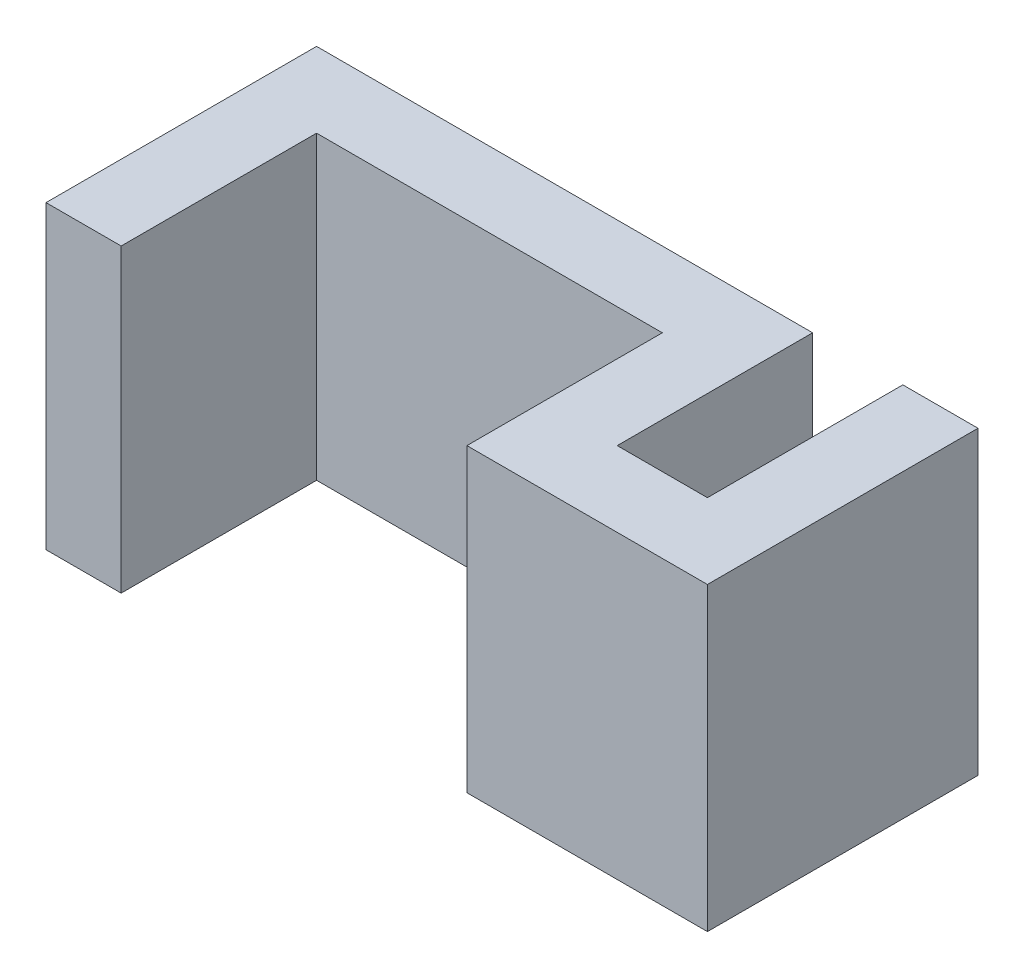
ISO-10303-21;
HEADER;
FILE_DESCRIPTION(('STEP AP214'),'2;1');
FILE_NAME('part.step','',(''),(''),'','','');
FILE_SCHEMA(('AUTOMOTIVE_DESIGN { 1 0 10303 214 1 1 1 1 }'));
ENDSEC;
DATA;
#1=APPLICATION_CONTEXT('core data for automotive mechanical design processes');
#2=APPLICATION_PROTOCOL_DEFINITION('international standard','automotive_design',2000,#1);
#3=PRODUCT_CONTEXT('',#1,'mechanical');
#4=PRODUCT('Part','Part','',(#3));
#5=PRODUCT_RELATED_PRODUCT_CATEGORY('part','',(#4));
#6=PRODUCT_DEFINITION_FORMATION('','',#4);
#7=PRODUCT_DEFINITION_CONTEXT('part definition',#1,'design');
#8=PRODUCT_DEFINITION('design','',#6,#7);
#9=PRODUCT_DEFINITION_SHAPE('','',#8);
#10=(LENGTH_UNIT() NAMED_UNIT(*) SI_UNIT(.MILLI.,.METRE.));
#11=(NAMED_UNIT(*) PLANE_ANGLE_UNIT() SI_UNIT($,.RADIAN.));
#12=(NAMED_UNIT(*) SI_UNIT($,.STERADIAN.) SOLID_ANGLE_UNIT());
#13=UNCERTAINTY_MEASURE_WITH_UNIT(LENGTH_MEASURE(1.E-05),#10,'distance_accuracy_value','');
#14=(GEOMETRIC_REPRESENTATION_CONTEXT(3) GLOBAL_UNCERTAINTY_ASSIGNED_CONTEXT((#13)) GLOBAL_UNIT_ASSIGNED_CONTEXT((#10,
#11,#12)) REPRESENTATION_CONTEXT('',''));
#15=CARTESIAN_POINT('',(0.,0.,0.));
#16=DIRECTION('',(0.,0.,1.));
#17=DIRECTION('',(1.,0.,0.));
#18=AXIS2_PLACEMENT_3D('',#15,#16,#17);
#19=CARTESIAN_POINT('',(71.12,50.8,-45.72));
#20=DIRECTION('',(0.,0.,1.));
#21=DIRECTION('',(1.,0.,0.));
#22=AXIS2_PLACEMENT_3D('',#19,#20,#21);
#23=PLANE('',#22);
#24=DIRECTION('',(-1.,0.,0.));
#25=VECTOR('',#24,1.);
#26=CARTESIAN_POINT('',(71.12,0.,-45.72));
#27=LINE('',#26,#25);
#28=CARTESIAN_POINT('',(71.12,0.,-45.72));
#29=VERTEX_POINT('',#28);
#30=CARTESIAN_POINT('',(-12.7,0.,-45.72));
#31=VERTEX_POINT('',#30);
#32=EDGE_CURVE('E153',#29,#31,#27,.T.);
#33=ORIENTED_EDGE('',*,*,#32,.T.);
#34=DIRECTION('',(0.,-1.,0.));
#35=VECTOR('',#34,1.);
#36=CARTESIAN_POINT('',(-12.7,50.8,-45.72));
#37=LINE('',#36,#35);
#38=CARTESIAN_POINT('',(-12.7,50.8,-45.72));
#39=VERTEX_POINT('',#38);
#40=EDGE_CURVE('E11',#39,#31,#37,.T.);
#41=ORIENTED_EDGE('',*,*,#40,.F.);
#42=DIRECTION('',(-1.,0.,0.));
#43=VECTOR('',#42,1.);
#44=CARTESIAN_POINT('',(71.12,50.8,-45.72));
#45=LINE('',#44,#43);
#46=CARTESIAN_POINT('',(71.12,50.8,-45.72));
#47=VERTEX_POINT('',#46);
#48=EDGE_CURVE('E175',#47,#39,#45,.T.);
#49=ORIENTED_EDGE('',*,*,#48,.F.);
#50=DIRECTION('',(0.,-1.,0.));
#51=VECTOR('',#50,1.);
#52=CARTESIAN_POINT('',(71.12,50.8,-45.72));
#53=LINE('',#52,#51);
#54=EDGE_CURVE('E149',#47,#29,#53,.T.);
#55=ORIENTED_EDGE('',*,*,#54,.T.);
#56=EDGE_LOOP('',(#33,#41,#49,#55));
#57=FACE_BOUND('',#56,.T.);
#58=ADVANCED_FACE('F33',(#57),#23,.F.);
#59=CARTESIAN_POINT('',(-12.7,50.8,-45.72));
#60=DIRECTION('',(1.,0.,0.));
#61=DIRECTION('',(0.,0.,-1.));
#62=AXIS2_PLACEMENT_3D('',#59,#60,#61);
#63=PLANE('',#62);
#64=DIRECTION('',(0.,0.,1.));
#65=VECTOR('',#64,1.);
#66=CARTESIAN_POINT('',(-12.7,0.,-45.72));
#67=LINE('',#66,#65);
#68=CARTESIAN_POINT('',(-12.7,0.,0.));
#69=VERTEX_POINT('',#68);
#70=EDGE_CURVE('E156',#31,#69,#67,.T.);
#71=ORIENTED_EDGE('',*,*,#70,.T.);
#72=DIRECTION('',(0.,-1.,0.));
#73=VECTOR('',#72,1.);
#74=CARTESIAN_POINT('',(-12.7,50.8,0.));
#75=LINE('',#74,#73);
#76=CARTESIAN_POINT('',(-12.7,50.8,0.));
#77=VERTEX_POINT('',#76);
#78=EDGE_CURVE('E41',#77,#69,#75,.T.);
#79=ORIENTED_EDGE('',*,*,#78,.F.);
#80=DIRECTION('',(0.,0.,1.));
#81=VECTOR('',#80,1.);
#82=CARTESIAN_POINT('',(-12.7,50.8,-45.72));
#83=LINE('',#82,#81);
#84=EDGE_CURVE('E104',#39,#77,#83,.T.);
#85=ORIENTED_EDGE('',*,*,#84,.F.);
#86=ORIENTED_EDGE('',*,*,#40,.T.);
#87=EDGE_LOOP('',(#71,#79,#85,#86));
#88=FACE_BOUND('',#87,.T.);
#89=ADVANCED_FACE('F253',(#88),#63,.F.);
#90=CARTESIAN_POINT('',(-12.7,50.8,0.));
#91=DIRECTION('',(0.,0.,-1.));
#92=DIRECTION('',(-1.,0.,0.));
#93=AXIS2_PLACEMENT_3D('',#90,#91,#92);
#94=PLANE('',#93);
#95=DIRECTION('',(1.,0.,0.));
#96=VECTOR('',#95,1.);
#97=CARTESIAN_POINT('',(-12.7,0.,0.));
#98=LINE('',#97,#96);
#99=CARTESIAN_POINT('',(0.,0.,0.));
#100=VERTEX_POINT('',#99);
#101=EDGE_CURVE('E158',#69,#100,#98,.T.);
#102=ORIENTED_EDGE('',*,*,#101,.T.);
#103=DIRECTION('',(0.,-1.,0.));
#104=VECTOR('',#103,1.);
#105=CARTESIAN_POINT('',(0.,50.8,0.));
#106=LINE('',#105,#104);
#107=CARTESIAN_POINT('',(0.,50.8,0.));
#108=VERTEX_POINT('',#107);
#109=EDGE_CURVE('E194',#108,#100,#106,.T.);
#110=ORIENTED_EDGE('',*,*,#109,.F.);
#111=DIRECTION('',(1.,0.,0.));
#112=VECTOR('',#111,1.);
#113=CARTESIAN_POINT('',(-12.7,50.8,0.));
#114=LINE('',#113,#112);
#115=EDGE_CURVE('E202',#77,#108,#114,.T.);
#116=ORIENTED_EDGE('',*,*,#115,.F.);
#117=ORIENTED_EDGE('',*,*,#78,.T.);
#118=EDGE_LOOP('',(#102,#110,#116,#117));
#119=FACE_BOUND('',#118,.T.);
#120=ADVANCED_FACE('F200',(#119),#94,.F.);
#121=CARTESIAN_POINT('',(0.,50.8,0.));
#122=DIRECTION('',(-1.,0.,0.));
#123=DIRECTION('',(0.,0.,1.));
#124=AXIS2_PLACEMENT_3D('',#121,#122,#123);
#125=PLANE('',#124);
#126=DIRECTION('',(0.,0.,-1.));
#127=VECTOR('',#126,1.);
#128=CARTESIAN_POINT('',(0.,0.,0.));
#129=LINE('',#128,#127);
#130=CARTESIAN_POINT('',(0.,0.,-33.02));
#131=VERTEX_POINT('',#130);
#132=EDGE_CURVE('E160',#100,#131,#129,.T.);
#133=ORIENTED_EDGE('',*,*,#132,.T.);
#134=DIRECTION('',(0.,-1.,0.));
#135=VECTOR('',#134,1.);
#136=CARTESIAN_POINT('',(0.,50.8,-33.02));
#137=LINE('',#136,#135);
#138=CARTESIAN_POINT('',(0.,50.8,-33.02));
#139=VERTEX_POINT('',#138);
#140=EDGE_CURVE('E191',#139,#131,#137,.T.);
#141=ORIENTED_EDGE('',*,*,#140,.F.);
#142=DIRECTION('',(0.,0.,-1.));
#143=VECTOR('',#142,1.);
#144=CARTESIAN_POINT('',(0.,50.8,0.));
#145=LINE('',#144,#143);
#146=EDGE_CURVE('E220',#108,#139,#145,.T.);
#147=ORIENTED_EDGE('',*,*,#146,.F.);
#148=ORIENTED_EDGE('',*,*,#109,.T.);
#149=EDGE_LOOP('',(#133,#141,#147,#148));
#150=FACE_BOUND('',#149,.T.);
#151=ADVANCED_FACE('F211',(#150),#125,.F.);
#152=CARTESIAN_POINT('',(0.,50.8,-33.02));
#153=DIRECTION('',(0.,0.,-1.));
#154=DIRECTION('',(-1.,0.,0.));
#155=AXIS2_PLACEMENT_3D('',#152,#153,#154);
#156=PLANE('',#155);
#157=DIRECTION('',(1.,0.,0.));
#158=VECTOR('',#157,1.);
#159=CARTESIAN_POINT('',(0.,0.,-33.02));
#160=LINE('',#159,#158);
#161=CARTESIAN_POINT('',(58.42,0.,-33.02));
#162=VERTEX_POINT('',#161);
#163=EDGE_CURVE('E162',#131,#162,#160,.T.);
#164=ORIENTED_EDGE('',*,*,#163,.T.);
#165=DIRECTION('',(0.,-1.,0.));
#166=VECTOR('',#165,1.);
#167=CARTESIAN_POINT('',(58.42,50.8,-33.02));
#168=LINE('',#167,#166);
#169=CARTESIAN_POINT('',(58.42,50.8,-33.02));
#170=VERTEX_POINT('',#169);
#171=EDGE_CURVE('E188',#170,#162,#168,.T.);
#172=ORIENTED_EDGE('',*,*,#171,.F.);
#173=DIRECTION('',(1.,0.,0.));
#174=VECTOR('',#173,1.);
#175=CARTESIAN_POINT('',(0.,50.8,-33.02));
#176=LINE('',#175,#174);
#177=EDGE_CURVE('E217',#139,#170,#176,.T.);
#178=ORIENTED_EDGE('',*,*,#177,.F.);
#179=ORIENTED_EDGE('',*,*,#140,.T.);
#180=EDGE_LOOP('',(#164,#172,#178,#179));
#181=FACE_BOUND('',#180,.T.);
#182=ADVANCED_FACE('F215',(#181),#156,.F.);
#183=CARTESIAN_POINT('',(58.42,50.8,-33.02));
#184=DIRECTION('',(1.,0.,0.));
#185=DIRECTION('',(0.,0.,-1.));
#186=AXIS2_PLACEMENT_3D('',#183,#184,#185);
#187=PLANE('',#186);
#188=DIRECTION('',(0.,0.,1.));
#189=VECTOR('',#188,1.);
#190=CARTESIAN_POINT('',(58.42,0.,-33.02));
#191=LINE('',#190,#189);
#192=CARTESIAN_POINT('',(58.42,0.,0.));
#193=VERTEX_POINT('',#192);
#194=EDGE_CURVE('E164',#162,#193,#191,.T.);
#195=ORIENTED_EDGE('',*,*,#194,.T.);
#196=DIRECTION('',(0.,-1.,0.));
#197=VECTOR('',#196,1.);
#198=CARTESIAN_POINT('',(58.42,50.8,0.));
#199=LINE('',#198,#197);
#200=CARTESIAN_POINT('',(58.42,50.8,0.));
#201=VERTEX_POINT('',#200);
#202=EDGE_CURVE('E185',#201,#193,#199,.T.);
#203=ORIENTED_EDGE('',*,*,#202,.F.);
#204=DIRECTION('',(0.,0.,1.));
#205=VECTOR('',#204,1.);
#206=CARTESIAN_POINT('',(58.42,50.8,-33.02));
#207=LINE('',#206,#205);
#208=EDGE_CURVE('E219',#170,#201,#207,.T.);
#209=ORIENTED_EDGE('',*,*,#208,.F.);
#210=ORIENTED_EDGE('',*,*,#171,.T.);
#211=EDGE_LOOP('',(#195,#203,#209,#210));
#212=FACE_BOUND('',#211,.T.);
#213=ADVANCED_FACE('F266',(#212),#187,.F.);
#214=CARTESIAN_POINT('',(58.42,50.8,0.));
#215=DIRECTION('',(0.,0.,-1.));
#216=DIRECTION('',(-1.,0.,0.));
#217=AXIS2_PLACEMENT_3D('',#214,#215,#216);
#218=PLANE('',#217);
#219=DIRECTION('',(1.,0.,0.));
#220=VECTOR('',#219,1.);
#221=CARTESIAN_POINT('',(58.42,0.,0.));
#222=LINE('',#221,#220);
#223=CARTESIAN_POINT('',(99.06,0.,0.));
#224=VERTEX_POINT('',#223);
#225=EDGE_CURVE('E166',#193,#224,#222,.T.);
#226=ORIENTED_EDGE('',*,*,#225,.T.);
#227=DIRECTION('',(0.,-1.,0.));
#228=VECTOR('',#227,1.);
#229=CARTESIAN_POINT('',(99.06,50.8,0.));
#230=LINE('',#229,#228);
#231=CARTESIAN_POINT('',(99.06,50.8,0.));
#232=VERTEX_POINT('',#231);
#233=EDGE_CURVE('E182',#232,#224,#230,.T.);
#234=ORIENTED_EDGE('',*,*,#233,.F.);
#235=DIRECTION('',(1.,0.,0.));
#236=VECTOR('',#235,1.);
#237=CARTESIAN_POINT('',(58.42,50.8,0.));
#238=LINE('',#237,#236);
#239=EDGE_CURVE('E222',#201,#232,#238,.T.);
#240=ORIENTED_EDGE('',*,*,#239,.F.);
#241=ORIENTED_EDGE('',*,*,#202,.T.);
#242=EDGE_LOOP('',(#226,#234,#240,#241));
#243=FACE_BOUND('',#242,.T.);
#244=ADVANCED_FACE('F269',(#243),#218,.F.);
#245=CARTESIAN_POINT('',(99.06,50.8,0.));
#246=DIRECTION('',(-1.,0.,0.));
#247=DIRECTION('',(0.,0.,1.));
#248=AXIS2_PLACEMENT_3D('',#245,#246,#247);
#249=PLANE('',#248);
#250=DIRECTION('',(0.,0.,-1.));
#251=VECTOR('',#250,1.);
#252=CARTESIAN_POINT('',(99.06,0.,0.));
#253=LINE('',#252,#251);
#254=CARTESIAN_POINT('',(99.06,0.,-45.72));
#255=VERTEX_POINT('',#254);
#256=EDGE_CURVE('E168',#224,#255,#253,.T.);
#257=ORIENTED_EDGE('',*,*,#256,.T.);
#258=DIRECTION('',(0.,-1.,0.));
#259=VECTOR('',#258,1.);
#260=CARTESIAN_POINT('',(99.06,50.8,-45.72));
#261=LINE('',#260,#259);
#262=CARTESIAN_POINT('',(99.06,50.8,-45.72));
#263=VERTEX_POINT('',#262);
#264=EDGE_CURVE('E179',#263,#255,#261,.T.);
#265=ORIENTED_EDGE('',*,*,#264,.F.);
#266=DIRECTION('',(0.,0.,-1.));
#267=VECTOR('',#266,1.);
#268=CARTESIAN_POINT('',(99.06,50.8,0.));
#269=LINE('',#268,#267);
#270=EDGE_CURVE('E228',#232,#263,#269,.T.);
#271=ORIENTED_EDGE('',*,*,#270,.F.);
#272=ORIENTED_EDGE('',*,*,#233,.T.);
#273=EDGE_LOOP('',(#257,#265,#271,#272));
#274=FACE_BOUND('',#273,.T.);
#275=ADVANCED_FACE('F234',(#274),#249,.F.);
#276=CARTESIAN_POINT('',(99.06,50.8,-45.72));
#277=DIRECTION('',(0.,0.,1.));
#278=DIRECTION('',(1.,0.,0.));
#279=AXIS2_PLACEMENT_3D('',#276,#277,#278);
#280=PLANE('',#279);
#281=DIRECTION('',(-1.,0.,0.));
#282=VECTOR('',#281,1.);
#283=CARTESIAN_POINT('',(99.06,0.,-45.72));
#284=LINE('',#283,#282);
#285=CARTESIAN_POINT('',(86.36,0.,-45.72));
#286=VERTEX_POINT('',#285);
#287=EDGE_CURVE('E170',#255,#286,#284,.T.);
#288=ORIENTED_EDGE('',*,*,#287,.T.);
#289=DIRECTION('',(0.,-1.,0.));
#290=VECTOR('',#289,1.);
#291=CARTESIAN_POINT('',(86.36,50.8,-45.72));
#292=LINE('',#291,#290);
#293=CARTESIAN_POINT('',(86.36,50.8,-45.72));
#294=VERTEX_POINT('',#293);
#295=EDGE_CURVE('E144',#294,#286,#292,.T.);
#296=ORIENTED_EDGE('',*,*,#295,.F.);
#297=DIRECTION('',(-1.,0.,0.));
#298=VECTOR('',#297,1.);
#299=CARTESIAN_POINT('',(99.06,50.8,-45.72));
#300=LINE('',#299,#298);
#301=EDGE_CURVE('E135',#263,#294,#300,.T.);
#302=ORIENTED_EDGE('',*,*,#301,.F.);
#303=ORIENTED_EDGE('',*,*,#264,.T.);
#304=EDGE_LOOP('',(#288,#296,#302,#303));
#305=FACE_BOUND('',#304,.T.);
#306=ADVANCED_FACE('F238',(#305),#280,.F.);
#307=CARTESIAN_POINT('',(86.36,50.8,-45.72));
#308=DIRECTION('',(1.,0.,0.));
#309=DIRECTION('',(0.,0.,-1.));
#310=AXIS2_PLACEMENT_3D('',#307,#308,#309);
#311=PLANE('',#310);
#312=DIRECTION('',(0.,0.,1.));
#313=VECTOR('',#312,1.);
#314=CARTESIAN_POINT('',(86.36,0.,-45.72));
#315=LINE('',#314,#313);
#316=CARTESIAN_POINT('',(86.36,0.,-12.7));
#317=VERTEX_POINT('',#316);
#318=EDGE_CURVE('E143',#286,#317,#315,.T.);
#319=ORIENTED_EDGE('',*,*,#318,.T.);
#320=DIRECTION('',(0.,-1.,0.));
#321=VECTOR('',#320,1.);
#322=CARTESIAN_POINT('',(86.36,50.8,-12.7));
#323=LINE('',#322,#321);
#324=CARTESIAN_POINT('',(86.36,50.8,-12.7));
#325=VERTEX_POINT('',#324);
#326=EDGE_CURVE('E140',#325,#317,#323,.T.);
#327=ORIENTED_EDGE('',*,*,#326,.F.);
#328=DIRECTION('',(0.,0.,1.));
#329=VECTOR('',#328,1.);
#330=CARTESIAN_POINT('',(86.36,50.8,-45.72));
#331=LINE('',#330,#329);
#332=EDGE_CURVE('E129',#294,#325,#331,.T.);
#333=ORIENTED_EDGE('',*,*,#332,.F.);
#334=ORIENTED_EDGE('',*,*,#295,.T.);
#335=EDGE_LOOP('',(#319,#327,#333,#334));
#336=FACE_BOUND('',#335,.T.);
#337=ADVANCED_FACE('F141',(#336),#311,.F.);
#338=CARTESIAN_POINT('',(86.36,50.8,-12.7));
#339=DIRECTION('',(0.,0.,1.));
#340=DIRECTION('',(1.,0.,0.));
#341=AXIS2_PLACEMENT_3D('',#338,#339,#340);
#342=PLANE('',#341);
#343=DIRECTION('',(-1.,0.,0.));
#344=VECTOR('',#343,1.);
#345=CARTESIAN_POINT('',(86.36,0.,-12.7));
#346=LINE('',#345,#344);
#347=CARTESIAN_POINT('',(71.12,0.,-12.7));
#348=VERTEX_POINT('',#347);
#349=EDGE_CURVE('E90',#317,#348,#346,.T.);
#350=ORIENTED_EDGE('',*,*,#349,.T.);
#351=DIRECTION('',(0.,-1.,0.));
#352=VECTOR('',#351,1.);
#353=CARTESIAN_POINT('',(71.12,50.8,-12.7));
#354=LINE('',#353,#352);
#355=CARTESIAN_POINT('',(71.12,50.8,-12.7));
#356=VERTEX_POINT('',#355);
#357=EDGE_CURVE('E145',#356,#348,#354,.T.);
#358=ORIENTED_EDGE('',*,*,#357,.F.);
#359=DIRECTION('',(-1.,0.,0.));
#360=VECTOR('',#359,1.);
#361=CARTESIAN_POINT('',(86.36,50.8,-12.7));
#362=LINE('',#361,#360);
#363=EDGE_CURVE('E133',#325,#356,#362,.T.);
#364=ORIENTED_EDGE('',*,*,#363,.F.);
#365=ORIENTED_EDGE('',*,*,#326,.T.);
#366=EDGE_LOOP('',(#350,#358,#364,#365));
#367=FACE_BOUND('',#366,.T.);
#368=ADVANCED_FACE('F147',(#367),#342,.F.);
#369=CARTESIAN_POINT('',(71.12,50.8,-12.7));
#370=DIRECTION('',(-1.,0.,0.));
#371=DIRECTION('',(0.,0.,1.));
#372=AXIS2_PLACEMENT_3D('',#369,#370,#371);
#373=PLANE('',#372);
#374=DIRECTION('',(0.,0.,-1.));
#375=VECTOR('',#374,1.);
#376=CARTESIAN_POINT('',(71.12,0.,-12.7));
#377=LINE('',#376,#375);
#378=EDGE_CURVE('E96',#348,#29,#377,.T.);
#379=ORIENTED_EDGE('',*,*,#378,.T.);
#380=ORIENTED_EDGE('',*,*,#54,.F.);
#381=DIRECTION('',(0.,0.,-1.));
#382=VECTOR('',#381,1.);
#383=CARTESIAN_POINT('',(71.12,50.8,-12.7));
#384=LINE('',#383,#382);
#385=EDGE_CURVE('E49',#356,#47,#384,.T.);
#386=ORIENTED_EDGE('',*,*,#385,.F.);
#387=ORIENTED_EDGE('',*,*,#357,.T.);
#388=EDGE_LOOP('',(#379,#380,#386,#387));
#389=FACE_BOUND('',#388,.T.);
#390=ADVANCED_FACE('F242',(#389),#373,.F.);
#391=CARTESIAN_POINT('',(0.,50.8,0.));
#392=DIRECTION('',(0.,1.,0.));
#393=DIRECTION('',(0.,0.,1.));
#394=AXIS2_PLACEMENT_3D('',#391,#392,#393);
#395=PLANE('',#394);
#396=ORIENTED_EDGE('',*,*,#48,.T.);
#397=ORIENTED_EDGE('',*,*,#84,.T.);
#398=ORIENTED_EDGE('',*,*,#115,.T.);
#399=ORIENTED_EDGE('',*,*,#146,.T.);
#400=ORIENTED_EDGE('',*,*,#177,.T.);
#401=ORIENTED_EDGE('',*,*,#208,.T.);
#402=ORIENTED_EDGE('',*,*,#239,.T.);
#403=ORIENTED_EDGE('',*,*,#270,.T.);
#404=ORIENTED_EDGE('',*,*,#301,.T.);
#405=ORIENTED_EDGE('',*,*,#332,.T.);
#406=ORIENTED_EDGE('',*,*,#363,.T.);
#407=ORIENTED_EDGE('',*,*,#385,.T.);
#408=EDGE_LOOP('',(#396,#397,#398,#399,#400,#401,#402,#403,#404,#405,#406,#407));
#409=FACE_BOUND('',#408,.T.);
#410=ADVANCED_FACE('F131',(#409),#395,.T.);
#411=CARTESIAN_POINT('',(0.,0.,0.));
#412=DIRECTION('',(0.,1.,0.));
#413=DIRECTION('',(0.,0.,1.));
#414=AXIS2_PLACEMENT_3D('',#411,#412,#413);
#415=PLANE('',#414);
#416=ORIENTED_EDGE('',*,*,#32,.F.);
#417=ORIENTED_EDGE('',*,*,#378,.F.);
#418=ORIENTED_EDGE('',*,*,#349,.F.);
#419=ORIENTED_EDGE('',*,*,#318,.F.);
#420=ORIENTED_EDGE('',*,*,#287,.F.);
#421=ORIENTED_EDGE('',*,*,#256,.F.);
#422=ORIENTED_EDGE('',*,*,#225,.F.);
#423=ORIENTED_EDGE('',*,*,#194,.F.);
#424=ORIENTED_EDGE('',*,*,#163,.F.);
#425=ORIENTED_EDGE('',*,*,#132,.F.);
#426=ORIENTED_EDGE('',*,*,#101,.F.);
#427=ORIENTED_EDGE('',*,*,#70,.F.);
#428=EDGE_LOOP('',(#416,#417,#418,#419,#420,#421,#422,#423,#424,#425,#426,#427));
#429=FACE_BOUND('',#428,.T.);
#430=ADVANCED_FACE('F206',(#429),#415,.F.);
#431=CLOSED_SHELL('',(#58,#89,#120,#151,#182,#213,#244,#275,#306,#337,#368,#390,#410,#430));
#432=MANIFOLD_SOLID_BREP('B2',#431);
#433=ADVANCED_BREP_SHAPE_REPRESENTATION('',(#18,#432),#14);
#434=SHAPE_DEFINITION_REPRESENTATION(#9,#433);
ENDSEC;
END-ISO-10303-21;
